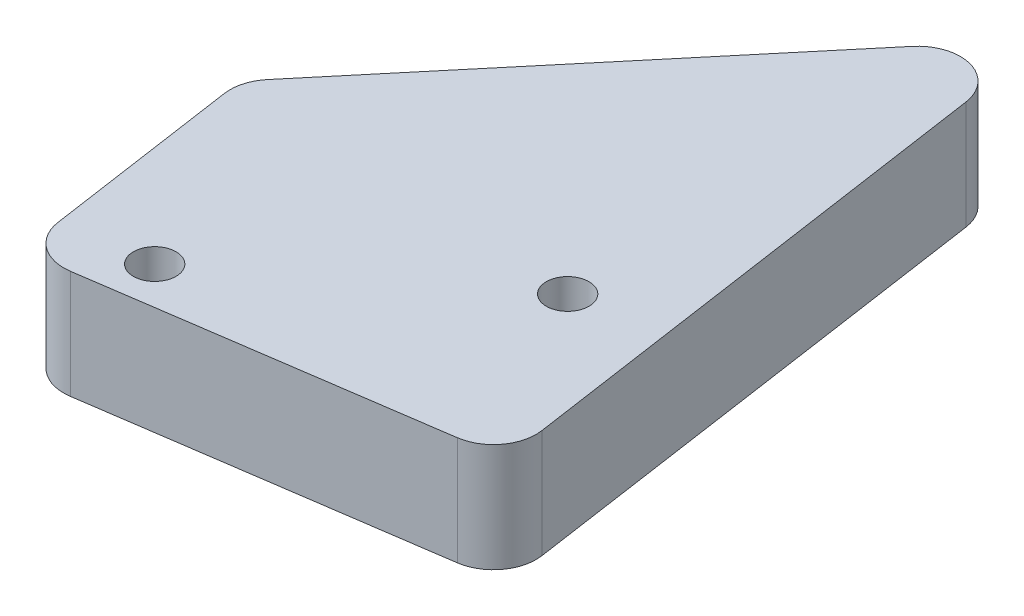
ISO-10303-21;
HEADER;
FILE_DESCRIPTION(('STEP AP214'),'2;1');
FILE_NAME('part.step','',(''),(''),'','','');
FILE_SCHEMA(('AUTOMOTIVE_DESIGN { 1 0 10303 214 1 1 1 1 }'));
ENDSEC;
DATA;
#1=APPLICATION_CONTEXT('core data for automotive mechanical design processes');
#2=APPLICATION_PROTOCOL_DEFINITION('international standard','automotive_design',2000,#1);
#3=PRODUCT_CONTEXT('',#1,'mechanical');
#4=PRODUCT('Part','Part','',(#3));
#5=PRODUCT_RELATED_PRODUCT_CATEGORY('part','',(#4));
#6=PRODUCT_DEFINITION_FORMATION('','',#4);
#7=PRODUCT_DEFINITION_CONTEXT('part definition',#1,'design');
#8=PRODUCT_DEFINITION('design','',#6,#7);
#9=PRODUCT_DEFINITION_SHAPE('','',#8);
#10=(LENGTH_UNIT() NAMED_UNIT(*) SI_UNIT(.MILLI.,.METRE.));
#11=(NAMED_UNIT(*) PLANE_ANGLE_UNIT() SI_UNIT($,.RADIAN.));
#12=(NAMED_UNIT(*) SI_UNIT($,.STERADIAN.) SOLID_ANGLE_UNIT());
#13=UNCERTAINTY_MEASURE_WITH_UNIT(LENGTH_MEASURE(1.E-05),#10,'distance_accuracy_value','');
#14=(GEOMETRIC_REPRESENTATION_CONTEXT(3) GLOBAL_UNCERTAINTY_ASSIGNED_CONTEXT((#13)) GLOBAL_UNIT_ASSIGNED_CONTEXT((#10,
#11,#12)) REPRESENTATION_CONTEXT('',''));
#15=CARTESIAN_POINT('',(0.,0.,0.));
#16=DIRECTION('',(0.,0.,1.));
#17=DIRECTION('',(1.,0.,0.));
#18=AXIS2_PLACEMENT_3D('',#15,#16,#17);
#19=CARTESIAN_POINT('',(0.,12.7,0.));
#20=DIRECTION('',(0.,-1.,0.));
#21=DIRECTION('',(0.,0.,-1.));
#22=AXIS2_PLACEMENT_3D('',#19,#20,#21);
#23=PLANE('',#22);
#24=DIRECTION('',(0.989499693481943,0.,-0.144534966700591));
#25=VECTOR('',#24,1.);
#26=CARTESIAN_POINT('',(-3.3556129512805,12.7,-79.8154192669371));
#27=LINE('',#26,#25);
#28=CARTESIAN_POINT('',(-47.883099157968,12.7,-73.3113457654105));
#29=VERTEX_POINT('',#28);
#30=CARTESIAN_POINT('',(-8.30311141869021,12.7,-79.0927444334342));
#31=VERTEX_POINT('',#30);
#32=EDGE_CURVE('E143',#29,#31,#27,.T.);
#33=ORIENTED_EDGE('',*,*,#32,.T.);
#34=CARTESIAN_POINT('',(-9.02578625219316,12.7,-84.0402429008439));
#35=DIRECTION('',(0.,-1.,0.));
#36=DIRECTION('',(0.,0.,-1.));
#37=AXIS2_PLACEMENT_3D('',#34,#35,#36);
#38=CIRCLE('',#37,5.);
#39=CARTESIAN_POINT('',(-4.07828778478345,12.7,-84.7629177343468));
#40=VERTEX_POINT('',#39);
#41=EDGE_CURVE('E158',#31,#40,#38,.F.);
#42=ORIENTED_EDGE('',*,*,#41,.T.);
#43=DIRECTION('',(-0.144534966700591,0.,-0.989499693481943));
#44=VECTOR('',#43,1.);
#45=CARTESIAN_POINT('',(-14.1957354538248,12.7,-154.027896278083));
#46=LINE('',#45,#44);
#47=CARTESIAN_POINT('',(-12.580741923724,12.7,-142.971501832575));
#48=VERTEX_POINT('',#47);
#49=EDGE_CURVE('E125',#40,#48,#46,.T.);
#50=ORIENTED_EDGE('',*,*,#49,.T.);
#51=CARTESIAN_POINT('',(-17.5282403911337,12.7,-142.248826999072));
#52=DIRECTION('',(0.,-1.,0.));
#53=DIRECTION('',(0.,0.,-1.));
#54=AXIS2_PLACEMENT_3D('',#51,#52,#53);
#55=CIRCLE('',#54,5.);
#56=CARTESIAN_POINT('',(-21.3638072349265,12.7,-145.456384790726));
#57=VERTEX_POINT('',#56);
#58=EDGE_CURVE('E153',#48,#57,#55,.F.);
#59=ORIENTED_EDGE('',*,*,#58,.T.);
#60=DIRECTION('',(-0.641511558330708,0.,0.76711336875856));
#61=VECTOR('',#60,1.);
#62=CARTESIAN_POINT('',(-14.1957354538248,12.7,-154.027896278083));
#63=LINE('',#62,#61);
#64=CARTESIAN_POINT('',(-55.7773465682871,12.7,-104.305004513785));
#65=VERTEX_POINT('',#64);
#66=EDGE_CURVE('E169',#57,#65,#63,.T.);
#67=ORIENTED_EDGE('',*,*,#66,.T.);
#68=CARTESIAN_POINT('',(-51.9417797244943,12.7,-101.097446722132));
#69=DIRECTION('',(0.,-1.,0.));
#70=DIRECTION('',(0.,0.,-1.));
#71=AXIS2_PLACEMENT_3D('',#68,#69,#70);
#72=CIRCLE('',#71,5.);
#73=CARTESIAN_POINT('',(-56.889278191904,12.7,-100.374771888629));
#74=VERTEX_POINT('',#73);
#75=EDGE_CURVE('E61',#65,#74,#72,.F.);
#76=ORIENTED_EDGE('',*,*,#75,.T.);
#77=DIRECTION('',(0.144534966700591,0.,0.989499693481943));
#78=VECTOR('',#77,1.);
#79=CARTESIAN_POINT('',(-52.8305976253777,12.7,-72.5886709319076));
#80=LINE('',#79,#78);
#81=CARTESIAN_POINT('',(-53.5532724588806,12.7,-77.5361693993173));
#82=VERTEX_POINT('',#81);
#83=EDGE_CURVE('E144',#74,#82,#80,.T.);
#84=ORIENTED_EDGE('',*,*,#83,.T.);
#85=CARTESIAN_POINT('',(-48.6057739914709,12.7,-78.2588442328202));
#86=DIRECTION('',(0.,-1.,0.));
#87=DIRECTION('',(0.,0.,-1.));
#88=AXIS2_PLACEMENT_3D('',#85,#86,#87);
#89=CIRCLE('',#88,5.);
#90=EDGE_CURVE('E156',#82,#29,#89,.F.);
#91=ORIENTED_EDGE('',*,*,#90,.T.);
#92=EDGE_LOOP('',(#33,#42,#50,#59,#67,#76,#84,#91));
#93=FACE_BOUND('',#92,.T.);
#94=CARTESIAN_POINT('',(-43.6582755240612,12.7,-78.9815190663232));
#95=DIRECTION('',(0.,1.,0.));
#96=DIRECTION('',(0.,0.,1.));
#97=AXIS2_PLACEMENT_3D('',#94,#95,#96);
#98=CIRCLE('',#97,2.5);
#99=CARTESIAN_POINT('',(-43.6582755240612,12.7,-76.4815190663232));
#100=VERTEX_POINT('',#99);
#101=EDGE_CURVE('E138',#100,#100,#98,.T.);
#102=ORIENTED_EDGE('',*,*,#101,.F.);
#103=EDGE_LOOP('',(#102));
#104=FACE_BOUND('',#103,.T.);
#105=CARTESIAN_POINT('',(-16.4303791535129,12.7,-100.139062856534));
#106=DIRECTION('',(0.,1.,0.));
#107=DIRECTION('',(0.,0.,1.));
#108=AXIS2_PLACEMENT_3D('',#105,#106,#107);
#109=CIRCLE('',#108,2.5);
#110=CARTESIAN_POINT('',(-16.4303791535129,12.7,-97.6390628565339));
#111=VERTEX_POINT('',#110);
#112=EDGE_CURVE('E186',#111,#111,#109,.T.);
#113=ORIENTED_EDGE('',*,*,#112,.F.);
#114=EDGE_LOOP('',(#113));
#115=FACE_BOUND('',#114,.T.);
#116=ADVANCED_FACE('F39',(#93,#104,#115),#23,.F.);
#117=CARTESIAN_POINT('',(0.,0.,0.));
#118=DIRECTION('',(0.,-1.,0.));
#119=DIRECTION('',(0.,0.,-1.));
#120=AXIS2_PLACEMENT_3D('',#117,#118,#119);
#121=PLANE('',#120);
#122=CARTESIAN_POINT('',(-43.6582755240612,0.,-78.9815190663232));
#123=DIRECTION('',(0.,1.,0.));
#124=DIRECTION('',(0.,0.,1.));
#125=AXIS2_PLACEMENT_3D('',#122,#123,#124);
#126=CIRCLE('',#125,2.5);
#127=CARTESIAN_POINT('',(-43.6582755240612,0.,-76.4815190663232));
#128=VERTEX_POINT('',#127);
#129=EDGE_CURVE('E183',#128,#128,#126,.T.);
#130=ORIENTED_EDGE('',*,*,#129,.T.);
#131=EDGE_LOOP('',(#130));
#132=FACE_BOUND('',#131,.T.);
#133=DIRECTION('',(-0.144534966700591,0.,-0.989499693481943));
#134=VECTOR('',#133,1.);
#135=CARTESIAN_POINT('',(-14.1957354538248,0.,-154.027896278083));
#136=LINE('',#135,#134);
#137=CARTESIAN_POINT('',(-4.07828778478345,0.,-84.7629177343468));
#138=VERTEX_POINT('',#137);
#139=CARTESIAN_POINT('',(-12.580741923724,0.,-142.971501832575));
#140=VERTEX_POINT('',#139);
#141=EDGE_CURVE('E122',#138,#140,#136,.T.);
#142=ORIENTED_EDGE('',*,*,#141,.F.);
#143=CARTESIAN_POINT('',(-9.02578625219316,0.,-84.0402429008439));
#144=DIRECTION('',(0.,-1.,0.));
#145=DIRECTION('',(0.,0.,-1.));
#146=AXIS2_PLACEMENT_3D('',#143,#144,#145);
#147=CIRCLE('',#146,5.);
#148=CARTESIAN_POINT('',(-8.30311141869021,0.,-79.0927444334342));
#149=VERTEX_POINT('',#148);
#150=EDGE_CURVE('E105',#138,#149,#147,.T.);
#151=ORIENTED_EDGE('',*,*,#150,.T.);
#152=DIRECTION('',(0.989499693481943,0.,-0.144534966700591));
#153=VECTOR('',#152,1.);
#154=CARTESIAN_POINT('',(-3.3556129512805,0.,-79.8154192669371));
#155=LINE('',#154,#153);
#156=CARTESIAN_POINT('',(-47.883099157968,0.,-73.3113457654105));
#157=VERTEX_POINT('',#156);
#158=EDGE_CURVE('E133',#157,#149,#155,.T.);
#159=ORIENTED_EDGE('',*,*,#158,.F.);
#160=CARTESIAN_POINT('',(-48.6057739914709,0.,-78.2588442328202));
#161=DIRECTION('',(0.,-1.,0.));
#162=DIRECTION('',(0.,0.,-1.));
#163=AXIS2_PLACEMENT_3D('',#160,#161,#162);
#164=CIRCLE('',#163,5.);
#165=CARTESIAN_POINT('',(-53.5532724588806,0.,-77.5361693993173));
#166=VERTEX_POINT('',#165);
#167=EDGE_CURVE('E116',#157,#166,#164,.T.);
#168=ORIENTED_EDGE('',*,*,#167,.T.);
#169=DIRECTION('',(0.144534966700591,0.,0.989499693481943));
#170=VECTOR('',#169,1.);
#171=CARTESIAN_POINT('',(-52.8305976253777,0.,-72.5886709319076));
#172=LINE('',#171,#170);
#173=CARTESIAN_POINT('',(-56.889278191904,0.,-100.374771888629));
#174=VERTEX_POINT('',#173);
#175=EDGE_CURVE('E136',#174,#166,#172,.T.);
#176=ORIENTED_EDGE('',*,*,#175,.F.);
#177=CARTESIAN_POINT('',(-51.9417797244943,0.,-101.097446722132));
#178=DIRECTION('',(0.,-1.,0.));
#179=DIRECTION('',(0.,0.,-1.));
#180=AXIS2_PLACEMENT_3D('',#177,#178,#179);
#181=CIRCLE('',#180,5.);
#182=CARTESIAN_POINT('',(-55.7773465682871,0.,-104.305004513785));
#183=VERTEX_POINT('',#182);
#184=EDGE_CURVE('E147',#174,#183,#181,.T.);
#185=ORIENTED_EDGE('',*,*,#184,.T.);
#186=DIRECTION('',(-0.641511558330708,0.,0.76711336875856));
#187=VECTOR('',#186,1.);
#188=CARTESIAN_POINT('',(-14.1957354538248,0.,-154.027896278083));
#189=LINE('',#188,#187);
#190=CARTESIAN_POINT('',(-21.3638072349265,0.,-145.456384790726));
#191=VERTEX_POINT('',#190);
#192=EDGE_CURVE('E132',#191,#183,#189,.T.);
#193=ORIENTED_EDGE('',*,*,#192,.F.);
#194=CARTESIAN_POINT('',(-17.5282403911337,0.,-142.248826999072));
#195=DIRECTION('',(0.,-1.,0.));
#196=DIRECTION('',(0.,0.,-1.));
#197=AXIS2_PLACEMENT_3D('',#194,#195,#196);
#198=CIRCLE('',#197,5.);
#199=EDGE_CURVE('E126',#191,#140,#198,.T.);
#200=ORIENTED_EDGE('',*,*,#199,.T.);
#201=EDGE_LOOP('',(#142,#151,#159,#168,#176,#185,#193,#200));
#202=FACE_BOUND('',#201,.T.);
#203=CARTESIAN_POINT('',(-16.4303791535129,0.,-100.139062856534));
#204=DIRECTION('',(0.,1.,0.));
#205=DIRECTION('',(0.,0.,1.));
#206=AXIS2_PLACEMENT_3D('',#203,#204,#205);
#207=CIRCLE('',#206,2.5);
#208=CARTESIAN_POINT('',(-16.4303791535129,0.,-97.6390628565339));
#209=VERTEX_POINT('',#208);
#210=EDGE_CURVE('E189',#209,#209,#207,.T.);
#211=ORIENTED_EDGE('',*,*,#210,.T.);
#212=EDGE_LOOP('',(#211));
#213=FACE_BOUND('',#212,.T.);
#214=ADVANCED_FACE('F129',(#132,#202,#213),#121,.T.);
#215=CARTESIAN_POINT('',(-3.3556129512805,12.7,-79.8154192669371));
#216=DIRECTION('',(-0.144534966700591,0.,-0.989499693481943));
#217=DIRECTION('',(-0.989499693481943,0.,0.144534966700591));
#218=AXIS2_PLACEMENT_3D('',#215,#216,#217);
#219=PLANE('',#218);
#220=ORIENTED_EDGE('',*,*,#158,.T.);
#221=DIRECTION('',(0.,-1.,0.));
#222=VECTOR('',#221,1.);
#223=CARTESIAN_POINT('',(-8.30311141869021,12.7,-79.0927444334342));
#224=LINE('',#223,#222);
#225=EDGE_CURVE('E110',#149,#31,#224,.F.);
#226=ORIENTED_EDGE('',*,*,#225,.T.);
#227=ORIENTED_EDGE('',*,*,#32,.F.);
#228=DIRECTION('',(0.,-1.,0.));
#229=VECTOR('',#228,1.);
#230=CARTESIAN_POINT('',(-47.883099157968,12.7,-73.3113457654105));
#231=LINE('',#230,#229);
#232=EDGE_CURVE('E115',#29,#157,#231,.T.);
#233=ORIENTED_EDGE('',*,*,#232,.T.);
#234=EDGE_LOOP('',(#220,#226,#227,#233));
#235=FACE_BOUND('',#234,.T.);
#236=ADVANCED_FACE('F204',(#235),#219,.F.);
#237=CARTESIAN_POINT('',(-14.1957354538248,12.7,-154.027896278083));
#238=DIRECTION('',(-0.989499693481943,0.,0.144534966700591));
#239=DIRECTION('',(0.144534966700591,0.,0.989499693481943));
#240=AXIS2_PLACEMENT_3D('',#237,#238,#239);
#241=PLANE('',#240);
#242=ORIENTED_EDGE('',*,*,#49,.F.);
#243=DIRECTION('',(0.,-1.,0.));
#244=VECTOR('',#243,1.);
#245=CARTESIAN_POINT('',(-4.07828778478345,12.7,-84.7629177343468));
#246=LINE('',#245,#244);
#247=EDGE_CURVE('E109',#40,#138,#246,.T.);
#248=ORIENTED_EDGE('',*,*,#247,.T.);
#249=ORIENTED_EDGE('',*,*,#141,.T.);
#250=DIRECTION('',(0.,-1.,0.));
#251=VECTOR('',#250,1.);
#252=CARTESIAN_POINT('',(-12.580741923724,12.7,-142.971501832575));
#253=LINE('',#252,#251);
#254=EDGE_CURVE('E127',#140,#48,#253,.F.);
#255=ORIENTED_EDGE('',*,*,#254,.T.);
#256=EDGE_LOOP('',(#242,#248,#249,#255));
#257=FACE_BOUND('',#256,.T.);
#258=ADVANCED_FACE('F121',(#257),#241,.F.);
#259=CARTESIAN_POINT('',(-14.1957354538248,12.7,-154.027896278083));
#260=DIRECTION('',(0.76711336875856,0.,0.641511558330708));
#261=DIRECTION('',(0.641511558330708,0.,-0.76711336875856));
#262=AXIS2_PLACEMENT_3D('',#259,#260,#261);
#263=PLANE('',#262);
#264=ORIENTED_EDGE('',*,*,#192,.T.);
#265=DIRECTION('',(0.,-1.,0.));
#266=VECTOR('',#265,1.);
#267=CARTESIAN_POINT('',(-55.7773465682871,12.7,-104.305004513785));
#268=LINE('',#267,#266);
#269=EDGE_CURVE('E11',#183,#65,#268,.F.);
#270=ORIENTED_EDGE('',*,*,#269,.T.);
#271=ORIENTED_EDGE('',*,*,#66,.F.);
#272=DIRECTION('',(0.,-1.,0.));
#273=VECTOR('',#272,1.);
#274=CARTESIAN_POINT('',(-21.3638072349265,12.7,-145.456384790726));
#275=LINE('',#274,#273);
#276=EDGE_CURVE('E47',#57,#191,#275,.T.);
#277=ORIENTED_EDGE('',*,*,#276,.T.);
#278=EDGE_LOOP('',(#264,#270,#271,#277));
#279=FACE_BOUND('',#278,.T.);
#280=ADVANCED_FACE('F167',(#279),#263,.F.);
#281=CARTESIAN_POINT('',(-52.8305976253777,12.7,-72.5886709319076));
#282=DIRECTION('',(0.989499693481943,0.,-0.144534966700591));
#283=DIRECTION('',(-0.144534966700591,0.,-0.989499693481943));
#284=AXIS2_PLACEMENT_3D('',#281,#282,#283);
#285=PLANE('',#284);
#286=ORIENTED_EDGE('',*,*,#175,.T.);
#287=DIRECTION('',(0.,-1.,0.));
#288=VECTOR('',#287,1.);
#289=CARTESIAN_POINT('',(-53.5532724588806,12.7,-77.5361693993173));
#290=LINE('',#289,#288);
#291=EDGE_CURVE('E54',#166,#82,#290,.F.);
#292=ORIENTED_EDGE('',*,*,#291,.T.);
#293=ORIENTED_EDGE('',*,*,#83,.F.);
#294=DIRECTION('',(0.,-1.,0.));
#295=VECTOR('',#294,1.);
#296=CARTESIAN_POINT('',(-56.889278191904,12.7,-100.374771888629));
#297=LINE('',#296,#295);
#298=EDGE_CURVE('E160',#74,#174,#297,.T.);
#299=ORIENTED_EDGE('',*,*,#298,.T.);
#300=EDGE_LOOP('',(#286,#292,#293,#299));
#301=FACE_BOUND('',#300,.T.);
#302=ADVANCED_FACE('F176',(#301),#285,.F.);
#303=CARTESIAN_POINT('',(-43.6582755240612,12.7,-78.9815190663232));
#304=DIRECTION('',(0.,-1.,0.));
#305=DIRECTION('',(0.,0.,-1.));
#306=AXIS2_PLACEMENT_3D('',#303,#304,#305);
#307=CYLINDRICAL_SURFACE('',#306,2.5);
#308=ORIENTED_EDGE('',*,*,#101,.T.);
#309=EDGE_LOOP('',(#308));
#310=FACE_BOUND('',#309,.T.);
#311=ORIENTED_EDGE('',*,*,#129,.F.);
#312=EDGE_LOOP('',(#311));
#313=FACE_BOUND('',#312,.T.);
#314=ADVANCED_FACE('F209',(#310,#313),#307,.F.);
#315=CARTESIAN_POINT('',(-16.4303791535129,12.7,-100.139062856534));
#316=DIRECTION('',(0.,-1.,0.));
#317=DIRECTION('',(0.,0.,-1.));
#318=AXIS2_PLACEMENT_3D('',#315,#316,#317);
#319=CYLINDRICAL_SURFACE('',#318,2.5);
#320=ORIENTED_EDGE('',*,*,#112,.T.);
#321=EDGE_LOOP('',(#320));
#322=FACE_BOUND('',#321,.T.);
#323=ORIENTED_EDGE('',*,*,#210,.F.);
#324=EDGE_LOOP('',(#323));
#325=FACE_BOUND('',#324,.T.);
#326=ADVANCED_FACE('F195',(#322,#325),#319,.F.);
#327=CARTESIAN_POINT('',(-9.02578625219316,12.7,-84.0402429008439));
#328=DIRECTION('',(0.,-1.,0.));
#329=DIRECTION('',(0.,0.,-1.));
#330=AXIS2_PLACEMENT_3D('',#327,#328,#329);
#331=CYLINDRICAL_SURFACE('',#330,5.);
#332=ORIENTED_EDGE('',*,*,#41,.F.);
#333=ORIENTED_EDGE('',*,*,#225,.F.);
#334=ORIENTED_EDGE('',*,*,#150,.F.);
#335=ORIENTED_EDGE('',*,*,#247,.F.);
#336=EDGE_LOOP('',(#332,#333,#334,#335));
#337=FACE_BOUND('',#336,.T.);
#338=ADVANCED_FACE('F108',(#337),#331,.T.);
#339=CARTESIAN_POINT('',(-48.6057739914709,12.7,-78.2588442328202));
#340=DIRECTION('',(0.,-1.,0.));
#341=DIRECTION('',(0.,0.,-1.));
#342=AXIS2_PLACEMENT_3D('',#339,#340,#341);
#343=CYLINDRICAL_SURFACE('',#342,5.);
#344=ORIENTED_EDGE('',*,*,#90,.F.);
#345=ORIENTED_EDGE('',*,*,#291,.F.);
#346=ORIENTED_EDGE('',*,*,#167,.F.);
#347=ORIENTED_EDGE('',*,*,#232,.F.);
#348=EDGE_LOOP('',(#344,#345,#346,#347));
#349=FACE_BOUND('',#348,.T.);
#350=ADVANCED_FACE('F223',(#349),#343,.T.);
#351=CARTESIAN_POINT('',(-51.9417797244943,12.7,-101.097446722132));
#352=DIRECTION('',(0.,-1.,0.));
#353=DIRECTION('',(0.,0.,-1.));
#354=AXIS2_PLACEMENT_3D('',#351,#352,#353);
#355=CYLINDRICAL_SURFACE('',#354,5.);
#356=ORIENTED_EDGE('',*,*,#75,.F.);
#357=ORIENTED_EDGE('',*,*,#269,.F.);
#358=ORIENTED_EDGE('',*,*,#184,.F.);
#359=ORIENTED_EDGE('',*,*,#298,.F.);
#360=EDGE_LOOP('',(#356,#357,#358,#359));
#361=FACE_BOUND('',#360,.T.);
#362=ADVANCED_FACE('F175',(#361),#355,.T.);
#363=CARTESIAN_POINT('',(-17.5282403911337,12.7,-142.248826999072));
#364=DIRECTION('',(0.,-1.,0.));
#365=DIRECTION('',(0.,0.,-1.));
#366=AXIS2_PLACEMENT_3D('',#363,#364,#365);
#367=CYLINDRICAL_SURFACE('',#366,5.);
#368=ORIENTED_EDGE('',*,*,#58,.F.);
#369=ORIENTED_EDGE('',*,*,#254,.F.);
#370=ORIENTED_EDGE('',*,*,#199,.F.);
#371=ORIENTED_EDGE('',*,*,#276,.F.);
#372=EDGE_LOOP('',(#368,#369,#370,#371));
#373=FACE_BOUND('',#372,.T.);
#374=ADVANCED_FACE('F41',(#373),#367,.T.);
#375=CLOSED_SHELL('',(#116,#214,#236,#258,#280,#302,#314,#326,#338,#350,#362,#374));
#376=MANIFOLD_SOLID_BREP('B2',#375);
#377=ADVANCED_BREP_SHAPE_REPRESENTATION('',(#18,#376),#14);
#378=SHAPE_DEFINITION_REPRESENTATION(#9,#377);
ENDSEC;
END-ISO-10303-21;
